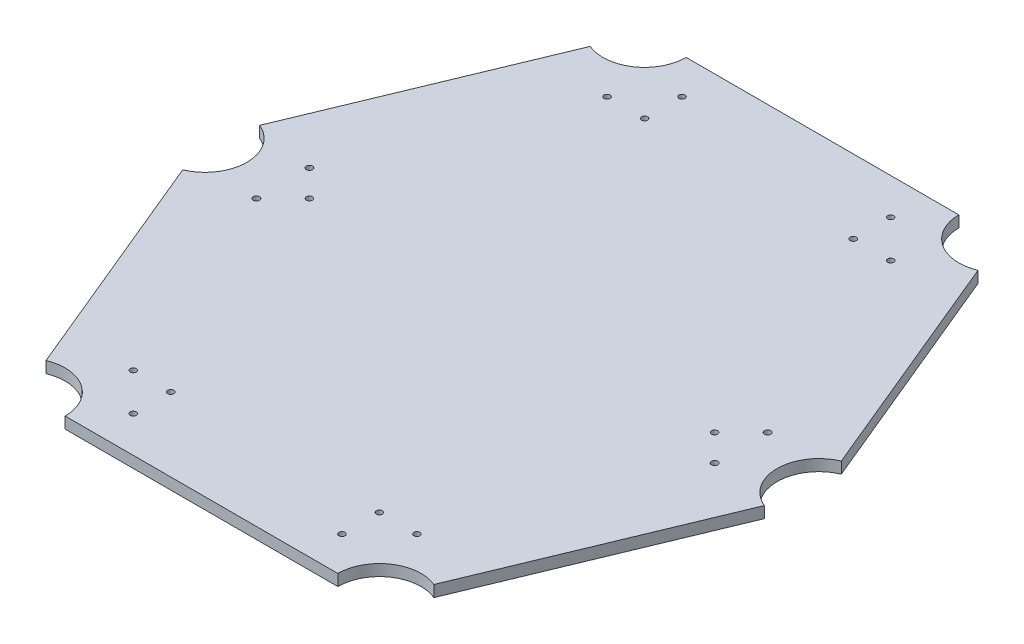
ISO-10303-21;
HEADER;
FILE_DESCRIPTION(('STEP AP214'),'2;1');
FILE_NAME('part.step','',(''),(''),'','','');
FILE_SCHEMA(('AUTOMOTIVE_DESIGN { 1 0 10303 214 1 1 1 1 }'));
ENDSEC;
DATA;
#1=APPLICATION_CONTEXT('core data for automotive mechanical design processes');
#2=APPLICATION_PROTOCOL_DEFINITION('international standard','automotive_design',2000,#1);
#3=PRODUCT_CONTEXT('',#1,'mechanical');
#4=PRODUCT('Part','Part','',(#3));
#5=PRODUCT_RELATED_PRODUCT_CATEGORY('part','',(#4));
#6=PRODUCT_DEFINITION_FORMATION('','',#4);
#7=PRODUCT_DEFINITION_CONTEXT('part definition',#1,'design');
#8=PRODUCT_DEFINITION('design','',#6,#7);
#9=PRODUCT_DEFINITION_SHAPE('','',#8);
#10=(LENGTH_UNIT() NAMED_UNIT(*) SI_UNIT(.MILLI.,.METRE.));
#11=(NAMED_UNIT(*) PLANE_ANGLE_UNIT() SI_UNIT($,.RADIAN.));
#12=(NAMED_UNIT(*) SI_UNIT($,.STERADIAN.) SOLID_ANGLE_UNIT());
#13=UNCERTAINTY_MEASURE_WITH_UNIT(LENGTH_MEASURE(1.E-05),#10,'distance_accuracy_value','');
#14=(GEOMETRIC_REPRESENTATION_CONTEXT(3) GLOBAL_UNCERTAINTY_ASSIGNED_CONTEXT((#13)) GLOBAL_UNIT_ASSIGNED_CONTEXT((#10,
#11,#12)) REPRESENTATION_CONTEXT('',''));
#15=CARTESIAN_POINT('',(0.,0.,0.));
#16=DIRECTION('',(0.,0.,1.));
#17=DIRECTION('',(1.,0.,0.));
#18=AXIS2_PLACEMENT_3D('',#15,#16,#17);
#19=CARTESIAN_POINT('',(47.,3.,82.));
#20=DIRECTION('',(-0.923742113571632,0.,-0.383015022700433));
#21=DIRECTION('',(-0.383015022700433,0.,0.923742113571632));
#22=AXIS2_PLACEMENT_3D('',#19,#20,#21);
#23=PLANE('',#22);
#24=DIRECTION('',(0.383015022700433,0.,-0.923742113571632));
#25=VECTOR('',#24,1.);
#26=CARTESIAN_POINT('',(47.,3.,82.));
#27=LINE('',#26,#25);
#28=CARTESIAN_POINT('',(51.2131652497048,3.,71.838836750712));
#29=VERTEX_POINT('',#28);
#30=CARTESIAN_POINT('',(76.7868347502952,3.,10.161163249288));
#31=VERTEX_POINT('',#30);
#32=EDGE_CURVE('E156',#29,#31,#27,.T.);
#33=ORIENTED_EDGE('',*,*,#32,.F.);
#34=DIRECTION('',(0.,1.,0.));
#35=VECTOR('',#34,1.);
#36=CARTESIAN_POINT('',(51.2131652497048,0.,71.838836750712));
#37=LINE('',#36,#35);
#38=CARTESIAN_POINT('',(51.2131652497048,0.,71.838836750712));
#39=VERTEX_POINT('',#38);
#40=EDGE_CURVE('E212',#29,#39,#37,.F.);
#41=ORIENTED_EDGE('',*,*,#40,.T.);
#42=DIRECTION('',(0.383015022700433,0.,-0.923742113571632));
#43=VECTOR('',#42,1.);
#44=CARTESIAN_POINT('',(47.,0.,82.));
#45=LINE('',#44,#43);
#46=CARTESIAN_POINT('',(76.7868347502952,0.,10.161163249288));
#47=VERTEX_POINT('',#46);
#48=EDGE_CURVE('E183',#39,#47,#45,.T.);
#49=ORIENTED_EDGE('',*,*,#48,.T.);
#50=DIRECTION('',(0.,1.,0.));
#51=VECTOR('',#50,1.);
#52=CARTESIAN_POINT('',(76.7868347502952,0.,10.161163249288));
#53=LINE('',#52,#51);
#54=EDGE_CURVE('E207',#47,#31,#53,.T.);
#55=ORIENTED_EDGE('',*,*,#54,.T.);
#56=EDGE_LOOP('',(#33,#41,#49,#55));
#57=FACE_BOUND('',#56,.T.);
#58=ADVANCED_FACE('F39',(#57),#23,.F.);
#59=CARTESIAN_POINT('',(47.,3.,-82.));
#60=DIRECTION('',(-0.923742113571632,0.,0.383015022700433));
#61=DIRECTION('',(0.383015022700433,0.,0.923742113571632));
#62=AXIS2_PLACEMENT_3D('',#59,#60,#61);
#63=PLANE('',#62);
#64=DIRECTION('',(-0.383015022700433,0.,-0.923742113571632));
#65=VECTOR('',#64,1.);
#66=CARTESIAN_POINT('',(47.,3.,-82.));
#67=LINE('',#66,#65);
#68=CARTESIAN_POINT('',(76.7868347502952,3.,-10.161163249288));
#69=VERTEX_POINT('',#68);
#70=CARTESIAN_POINT('',(51.2131652497048,3.,-71.838836750712));
#71=VERTEX_POINT('',#70);
#72=EDGE_CURVE('E162',#69,#71,#67,.T.);
#73=ORIENTED_EDGE('',*,*,#72,.F.);
#74=DIRECTION('',(0.,1.,0.));
#75=VECTOR('',#74,1.);
#76=CARTESIAN_POINT('',(76.7868347502952,0.,-10.161163249288));
#77=LINE('',#76,#75);
#78=CARTESIAN_POINT('',(76.7868347502952,0.,-10.161163249288));
#79=VERTEX_POINT('',#78);
#80=EDGE_CURVE('E191',#69,#79,#77,.F.);
#81=ORIENTED_EDGE('',*,*,#80,.T.);
#82=DIRECTION('',(-0.383015022700433,0.,-0.923742113571632));
#83=VECTOR('',#82,1.);
#84=CARTESIAN_POINT('',(47.,0.,-82.));
#85=LINE('',#84,#83);
#86=CARTESIAN_POINT('',(51.2131652497048,0.,-71.838836750712));
#87=VERTEX_POINT('',#86);
#88=EDGE_CURVE('E151',#79,#87,#85,.T.);
#89=ORIENTED_EDGE('',*,*,#88,.T.);
#90=DIRECTION('',(0.,1.,0.));
#91=VECTOR('',#90,1.);
#92=CARTESIAN_POINT('',(51.2131652497048,0.,-71.838836750712));
#93=LINE('',#92,#91);
#94=EDGE_CURVE('E52',#87,#71,#93,.T.);
#95=ORIENTED_EDGE('',*,*,#94,.T.);
#96=EDGE_LOOP('',(#73,#81,#89,#95));
#97=FACE_BOUND('',#96,.T.);
#98=ADVANCED_FACE('F190',(#97),#63,.F.);
#99=CARTESIAN_POINT('',(-47.,3.,-82.));
#100=DIRECTION('',(0.,0.,1.));
#101=DIRECTION('',(1.,0.,0.));
#102=AXIS2_PLACEMENT_3D('',#99,#100,#101);
#103=PLANE('',#102);
#104=DIRECTION('',(-1.,0.,0.));
#105=VECTOR('',#104,1.);
#106=CARTESIAN_POINT('',(-47.,3.,-82.));
#107=LINE('',#106,#105);
#108=CARTESIAN_POINT('',(36.,3.,-82.));
#109=VERTEX_POINT('',#108);
#110=CARTESIAN_POINT('',(-36.,3.,-82.));
#111=VERTEX_POINT('',#110);
#112=EDGE_CURVE('E169',#109,#111,#107,.T.);
#113=ORIENTED_EDGE('',*,*,#112,.F.);
#114=DIRECTION('',(0.,1.,0.));
#115=VECTOR('',#114,1.);
#116=CARTESIAN_POINT('',(36.,0.,-82.));
#117=LINE('',#116,#115);
#118=CARTESIAN_POINT('',(36.,0.,-82.));
#119=VERTEX_POINT('',#118);
#120=EDGE_CURVE('E197',#109,#119,#117,.F.);
#121=ORIENTED_EDGE('',*,*,#120,.T.);
#122=DIRECTION('',(-1.,0.,0.));
#123=VECTOR('',#122,1.);
#124=CARTESIAN_POINT('',(-47.,0.,-82.));
#125=LINE('',#124,#123);
#126=CARTESIAN_POINT('',(-36.,0.,-82.));
#127=VERTEX_POINT('',#126);
#128=EDGE_CURVE('E146',#119,#127,#125,.T.);
#129=ORIENTED_EDGE('',*,*,#128,.T.);
#130=DIRECTION('',(0.,1.,0.));
#131=VECTOR('',#130,1.);
#132=CARTESIAN_POINT('',(-36.,0.,-82.));
#133=LINE('',#132,#131);
#134=EDGE_CURVE('E60',#127,#111,#133,.T.);
#135=ORIENTED_EDGE('',*,*,#134,.T.);
#136=EDGE_LOOP('',(#113,#121,#129,#135));
#137=FACE_BOUND('',#136,.T.);
#138=ADVANCED_FACE('F201',(#137),#103,.F.);
#139=CARTESIAN_POINT('',(-47.,3.,-82.));
#140=DIRECTION('',(0.923742113571632,0.,0.383015022700433));
#141=DIRECTION('',(0.383015022700433,0.,-0.923742113571632));
#142=AXIS2_PLACEMENT_3D('',#139,#140,#141);
#143=PLANE('',#142);
#144=DIRECTION('',(-0.383015022700433,0.,0.923742113571632));
#145=VECTOR('',#144,1.);
#146=CARTESIAN_POINT('',(-47.,0.,-82.));
#147=LINE('',#146,#145);
#148=CARTESIAN_POINT('',(-51.2131652497048,0.,-71.838836750712));
#149=VERTEX_POINT('',#148);
#150=CARTESIAN_POINT('',(-76.7868347502952,0.,-10.161163249288));
#151=VERTEX_POINT('',#150);
#152=EDGE_CURVE('E137',#149,#151,#147,.T.);
#153=ORIENTED_EDGE('',*,*,#152,.T.);
#154=DIRECTION('',(0.,1.,0.));
#155=VECTOR('',#154,1.);
#156=CARTESIAN_POINT('',(-76.7868347502952,0.,-10.161163249288));
#157=LINE('',#156,#155);
#158=CARTESIAN_POINT('',(-76.7868347502952,3.,-10.161163249288));
#159=VERTEX_POINT('',#158);
#160=EDGE_CURVE('E172',#151,#159,#157,.T.);
#161=ORIENTED_EDGE('',*,*,#160,.T.);
#162=DIRECTION('',(-0.383015022700433,0.,0.923742113571632));
#163=VECTOR('',#162,1.);
#164=CARTESIAN_POINT('',(-47.,3.,-82.));
#165=LINE('',#164,#163);
#166=CARTESIAN_POINT('',(-51.2131652497048,3.,-71.838836750712));
#167=VERTEX_POINT('',#166);
#168=EDGE_CURVE('E139',#167,#159,#165,.T.);
#169=ORIENTED_EDGE('',*,*,#168,.F.);
#170=DIRECTION('',(0.,1.,0.));
#171=VECTOR('',#170,1.);
#172=CARTESIAN_POINT('',(-51.2131652497048,0.,-71.838836750712));
#173=LINE('',#172,#171);
#174=EDGE_CURVE('E125',#167,#149,#173,.F.);
#175=ORIENTED_EDGE('',*,*,#174,.T.);
#176=EDGE_LOOP('',(#153,#161,#169,#175));
#177=FACE_BOUND('',#176,.T.);
#178=ADVANCED_FACE('F135',(#177),#143,.F.);
#179=CARTESIAN_POINT('',(-47.,3.,82.));
#180=DIRECTION('',(0.923742113571632,0.,-0.383015022700433));
#181=DIRECTION('',(-0.383015022700433,0.,-0.923742113571632));
#182=AXIS2_PLACEMENT_3D('',#179,#180,#181);
#183=PLANE('',#182);
#184=DIRECTION('',(0.383015022700433,0.,0.923742113571632));
#185=VECTOR('',#184,1.);
#186=CARTESIAN_POINT('',(-47.,3.,82.));
#187=LINE('',#186,#185);
#188=CARTESIAN_POINT('',(-76.7868347502952,3.,10.161163249288));
#189=VERTEX_POINT('',#188);
#190=CARTESIAN_POINT('',(-51.2131652497048,3.,71.838836750712));
#191=VERTEX_POINT('',#190);
#192=EDGE_CURVE('E178',#189,#191,#187,.T.);
#193=ORIENTED_EDGE('',*,*,#192,.F.);
#194=DIRECTION('',(0.,1.,0.));
#195=VECTOR('',#194,1.);
#196=CARTESIAN_POINT('',(-76.7868347502952,0.,10.161163249288));
#197=LINE('',#196,#195);
#198=CARTESIAN_POINT('',(-76.7868347502952,0.,10.161163249288));
#199=VERTEX_POINT('',#198);
#200=EDGE_CURVE('E219',#189,#199,#197,.F.);
#201=ORIENTED_EDGE('',*,*,#200,.T.);
#202=DIRECTION('',(0.383015022700433,0.,0.923742113571632));
#203=VECTOR('',#202,1.);
#204=CARTESIAN_POINT('',(-47.,0.,82.));
#205=LINE('',#204,#203);
#206=CARTESIAN_POINT('',(-51.2131652497048,0.,71.838836750712));
#207=VERTEX_POINT('',#206);
#208=EDGE_CURVE('E145',#199,#207,#205,.T.);
#209=ORIENTED_EDGE('',*,*,#208,.T.);
#210=DIRECTION('',(0.,1.,0.));
#211=VECTOR('',#210,1.);
#212=CARTESIAN_POINT('',(-51.2131652497048,0.,71.838836750712));
#213=LINE('',#212,#211);
#214=EDGE_CURVE('E217',#207,#191,#213,.T.);
#215=ORIENTED_EDGE('',*,*,#214,.T.);
#216=EDGE_LOOP('',(#193,#201,#209,#215));
#217=FACE_BOUND('',#216,.T.);
#218=ADVANCED_FACE('F404',(#217),#183,.F.);
#219=CARTESIAN_POINT('',(-47.,3.,82.));
#220=DIRECTION('',(0.,0.,-1.));
#221=DIRECTION('',(-1.,0.,0.));
#222=AXIS2_PLACEMENT_3D('',#219,#220,#221);
#223=PLANE('',#222);
#224=DIRECTION('',(1.,0.,0.));
#225=VECTOR('',#224,1.);
#226=CARTESIAN_POINT('',(-47.,3.,82.));
#227=LINE('',#226,#225);
#228=CARTESIAN_POINT('',(-36.,3.,82.));
#229=VERTEX_POINT('',#228);
#230=CARTESIAN_POINT('',(36.,3.,82.));
#231=VERTEX_POINT('',#230);
#232=EDGE_CURVE('E131',#229,#231,#227,.T.);
#233=ORIENTED_EDGE('',*,*,#232,.F.);
#234=DIRECTION('',(0.,1.,0.));
#235=VECTOR('',#234,1.);
#236=CARTESIAN_POINT('',(-36.,0.,82.));
#237=LINE('',#236,#235);
#238=CARTESIAN_POINT('',(-36.,0.,82.));
#239=VERTEX_POINT('',#238);
#240=EDGE_CURVE('E215',#229,#239,#237,.F.);
#241=ORIENTED_EDGE('',*,*,#240,.T.);
#242=DIRECTION('',(1.,0.,0.));
#243=VECTOR('',#242,1.);
#244=CARTESIAN_POINT('',(-47.,0.,82.));
#245=LINE('',#244,#243);
#246=CARTESIAN_POINT('',(36.,0.,82.));
#247=VERTEX_POINT('',#246);
#248=EDGE_CURVE('E149',#239,#247,#245,.T.);
#249=ORIENTED_EDGE('',*,*,#248,.T.);
#250=DIRECTION('',(0.,1.,0.));
#251=VECTOR('',#250,1.);
#252=CARTESIAN_POINT('',(36.,0.,82.));
#253=LINE('',#252,#251);
#254=EDGE_CURVE('E210',#247,#231,#253,.T.);
#255=ORIENTED_EDGE('',*,*,#254,.T.);
#256=EDGE_LOOP('',(#233,#241,#249,#255));
#257=FACE_BOUND('',#256,.T.);
#258=ADVANCED_FACE('F398',(#257),#223,.F.);
#259=CARTESIAN_POINT('',(0.,3.,0.));
#260=DIRECTION('',(0.,-1.,0.));
#261=DIRECTION('',(0.,0.,-1.));
#262=AXIS2_PLACEMENT_3D('',#259,#260,#261);
#263=PLANE('',#262);
#264=CARTESIAN_POINT('',(60.5,3.,-7.));
#265=DIRECTION('',(0.,-1.,0.));
#266=DIRECTION('',(0.,0.,1.));
#267=AXIS2_PLACEMENT_3D('',#264,#265,#266);
#268=CIRCLE('',#267,0.825279091230489);
#269=CARTESIAN_POINT('',(60.5,3.,-6.17472090876951));
#270=VERTEX_POINT('',#269);
#271=EDGE_CURVE('E329',#270,#270,#268,.T.);
#272=ORIENTED_EDGE('',*,*,#271,.T.);
#273=EDGE_LOOP('',(#272));
#274=FACE_BOUND('',#273,.T.);
#275=CARTESIAN_POINT('',(60.5,3.,7.));
#276=DIRECTION('',(0.,-1.,0.));
#277=DIRECTION('',(0.,0.,-1.));
#278=AXIS2_PLACEMENT_3D('',#275,#276,#277);
#279=CIRCLE('',#278,0.825279091230489);
#280=CARTESIAN_POINT('',(60.5,3.,6.17472090876951));
#281=VERTEX_POINT('',#280);
#282=EDGE_CURVE('E323',#281,#281,#279,.T.);
#283=ORIENTED_EDGE('',*,*,#282,.T.);
#284=EDGE_LOOP('',(#283));
#285=FACE_BOUND('',#284,.T.);
#286=CARTESIAN_POINT('',(27.55456351737,3.,62.5545635173699));
#287=DIRECTION('',(0.,-1.,0.));
#288=DIRECTION('',(0.,0.,1.));
#289=AXIS2_PLACEMENT_3D('',#286,#287,#288);
#290=CIRCLE('',#289,0.8);
#291=CARTESIAN_POINT('',(27.55456351737,3.,63.3545635173699));
#292=VERTEX_POINT('',#291);
#293=EDGE_CURVE('E317',#292,#292,#290,.T.);
#294=ORIENTED_EDGE('',*,*,#293,.T.);
#295=EDGE_LOOP('',(#294));
#296=FACE_BOUND('',#295,.T.);
#297=CARTESIAN_POINT('',(37.4540584539817,3.,62.5545635173699));
#298=DIRECTION('',(0.,-1.,0.));
#299=DIRECTION('',(0.,0.,1.));
#300=AXIS2_PLACEMENT_3D('',#297,#298,#299);
#301=CIRCLE('',#300,0.800000000000003);
#302=CARTESIAN_POINT('',(37.4540584539817,3.,63.3545635173699));
#303=VERTEX_POINT('',#302);
#304=EDGE_CURVE('E310',#303,#303,#301,.T.);
#305=ORIENTED_EDGE('',*,*,#304,.T.);
#306=EDGE_LOOP('',(#305));
#307=FACE_BOUND('',#306,.T.);
#308=CARTESIAN_POINT('',(37.4540584539815,3.,-62.55456351737));
#309=DIRECTION('',(0.,-1.,0.));
#310=DIRECTION('',(0.,0.,-1.));
#311=AXIS2_PLACEMENT_3D('',#308,#309,#310);
#312=CIRCLE('',#311,0.799999999999988);
#313=CARTESIAN_POINT('',(37.4540584539815,3.,-63.35456351737));
#314=VERTEX_POINT('',#313);
#315=EDGE_CURVE('E346',#314,#314,#312,.T.);
#316=ORIENTED_EDGE('',*,*,#315,.T.);
#317=EDGE_LOOP('',(#316));
#318=FACE_BOUND('',#317,.T.);
#319=CARTESIAN_POINT('',(27.5545635173698,3.,-62.5545635173701));
#320=DIRECTION('',(0.,-1.,0.));
#321=DIRECTION('',(0.,0.,1.));
#322=AXIS2_PLACEMENT_3D('',#319,#320,#321);
#323=CIRCLE('',#322,0.799999999999998);
#324=CARTESIAN_POINT('',(27.5545635173698,3.,-61.7545635173701));
#325=VERTEX_POINT('',#324);
#326=EDGE_CURVE('E352',#325,#325,#323,.T.);
#327=ORIENTED_EDGE('',*,*,#326,.T.);
#328=EDGE_LOOP('',(#327));
#329=FACE_BOUND('',#328,.T.);
#330=CARTESIAN_POINT('',(27.55456351737,3.,72.4540584539816));
#331=DIRECTION('',(0.,-1.,0.));
#332=DIRECTION('',(0.,0.,-1.));
#333=AXIS2_PLACEMENT_3D('',#330,#331,#332);
#334=CIRCLE('',#333,0.800000000000001);
#335=CARTESIAN_POINT('',(27.55456351737,3.,71.6540584539816));
#336=VERTEX_POINT('',#335);
#337=EDGE_CURVE('E334',#336,#336,#334,.T.);
#338=ORIENTED_EDGE('',*,*,#337,.T.);
#339=EDGE_LOOP('',(#338));
#340=FACE_BOUND('',#339,.T.);
#341=CARTESIAN_POINT('',(27.5545635173699,3.,-72.4540584539817));
#342=DIRECTION('',(0.,-1.,0.));
#343=DIRECTION('',(0.,0.,1.));
#344=AXIS2_PLACEMENT_3D('',#341,#342,#343);
#345=CIRCLE('',#344,0.799999999999999);
#346=CARTESIAN_POINT('',(27.5545635173699,3.,-71.6540584539817));
#347=VERTEX_POINT('',#346);
#348=EDGE_CURVE('E341',#347,#347,#345,.T.);
#349=ORIENTED_EDGE('',*,*,#348,.T.);
#350=EDGE_LOOP('',(#349));
#351=FACE_BOUND('',#350,.T.);
#352=CARTESIAN_POINT('',(53.5,3.,0.));
#353=DIRECTION('',(0.,-1.,0.));
#354=DIRECTION('',(0.,0.,1.));
#355=AXIS2_PLACEMENT_3D('',#352,#353,#354);
#356=CIRCLE('',#355,0.800000000000003);
#357=CARTESIAN_POINT('',(53.5,3.,0.800000000000003));
#358=VERTEX_POINT('',#357);
#359=EDGE_CURVE('E304',#358,#358,#356,.T.);
#360=ORIENTED_EDGE('',*,*,#359,.T.);
#361=EDGE_LOOP('',(#360));
#362=FACE_BOUND('',#361,.T.);
#363=CARTESIAN_POINT('',(-60.5,3.,-7.));
#364=DIRECTION('',(0.,1.,0.));
#365=DIRECTION('',(0.,0.,1.));
#366=AXIS2_PLACEMENT_3D('',#363,#364,#365);
#367=CIRCLE('',#366,0.825279091230489);
#368=CARTESIAN_POINT('',(-60.5,3.,-6.17472090876951));
#369=VERTEX_POINT('',#368);
#370=EDGE_CURVE('E253',#369,#369,#367,.T.);
#371=ORIENTED_EDGE('',*,*,#370,.F.);
#372=EDGE_LOOP('',(#371));
#373=FACE_BOUND('',#372,.T.);
#374=CARTESIAN_POINT('',(-60.5,3.,7.));
#375=DIRECTION('',(0.,1.,0.));
#376=DIRECTION('',(0.,0.,-1.));
#377=AXIS2_PLACEMENT_3D('',#374,#375,#376);
#378=CIRCLE('',#377,0.825279091230489);
#379=CARTESIAN_POINT('',(-60.5,3.,6.17472090876951));
#380=VERTEX_POINT('',#379);
#381=EDGE_CURVE('E272',#380,#380,#378,.T.);
#382=ORIENTED_EDGE('',*,*,#381,.F.);
#383=EDGE_LOOP('',(#382));
#384=FACE_BOUND('',#383,.T.);
#385=CARTESIAN_POINT('',(-27.55456351737,3.,62.5545635173699));
#386=DIRECTION('',(0.,1.,0.));
#387=DIRECTION('',(0.,0.,1.));
#388=AXIS2_PLACEMENT_3D('',#385,#386,#387);
#389=CIRCLE('',#388,0.8);
#390=CARTESIAN_POINT('',(-27.55456351737,3.,63.3545635173699));
#391=VERTEX_POINT('',#390);
#392=EDGE_CURVE('E266',#391,#391,#389,.T.);
#393=ORIENTED_EDGE('',*,*,#392,.F.);
#394=EDGE_LOOP('',(#393));
#395=FACE_BOUND('',#394,.T.);
#396=CARTESIAN_POINT('',(-37.4540584539817,3.,62.5545635173699));
#397=DIRECTION('',(0.,1.,0.));
#398=DIRECTION('',(0.,0.,1.));
#399=AXIS2_PLACEMENT_3D('',#396,#397,#398);
#400=CIRCLE('',#399,0.800000000000003);
#401=CARTESIAN_POINT('',(-37.4540584539817,3.,63.3545635173699));
#402=VERTEX_POINT('',#401);
#403=EDGE_CURVE('E259',#402,#402,#400,.T.);
#404=ORIENTED_EDGE('',*,*,#403,.F.);
#405=EDGE_LOOP('',(#404));
#406=FACE_BOUND('',#405,.T.);
#407=CARTESIAN_POINT('',(-37.4540584539815,3.,-62.55456351737));
#408=DIRECTION('',(0.,1.,0.));
#409=DIRECTION('',(0.,0.,-1.));
#410=AXIS2_PLACEMENT_3D('',#407,#408,#409);
#411=CIRCLE('',#410,0.799999999999988);
#412=CARTESIAN_POINT('',(-37.4540584539815,3.,-63.35456351737));
#413=VERTEX_POINT('',#412);
#414=EDGE_CURVE('E295',#413,#413,#411,.T.);
#415=ORIENTED_EDGE('',*,*,#414,.F.);
#416=EDGE_LOOP('',(#415));
#417=FACE_BOUND('',#416,.T.);
#418=CARTESIAN_POINT('',(-27.5545635173698,3.,-62.5545635173701));
#419=DIRECTION('',(0.,1.,0.));
#420=DIRECTION('',(0.,0.,1.));
#421=AXIS2_PLACEMENT_3D('',#418,#419,#420);
#422=CIRCLE('',#421,0.799999999999998);
#423=CARTESIAN_POINT('',(-27.5545635173698,3.,-61.7545635173701));
#424=VERTEX_POINT('',#423);
#425=EDGE_CURVE('E284',#424,#424,#422,.T.);
#426=ORIENTED_EDGE('',*,*,#425,.F.);
#427=EDGE_LOOP('',(#426));
#428=FACE_BOUND('',#427,.T.);
#429=CARTESIAN_POINT('',(-27.55456351737,3.,72.4540584539816));
#430=DIRECTION('',(0.,1.,0.));
#431=DIRECTION('',(0.,0.,-1.));
#432=AXIS2_PLACEMENT_3D('',#429,#430,#431);
#433=CIRCLE('',#432,0.800000000000001);
#434=CARTESIAN_POINT('',(-27.55456351737,3.,71.6540584539816));
#435=VERTEX_POINT('',#434);
#436=EDGE_CURVE('E283',#435,#435,#433,.T.);
#437=ORIENTED_EDGE('',*,*,#436,.F.);
#438=EDGE_LOOP('',(#437));
#439=FACE_BOUND('',#438,.T.);
#440=CARTESIAN_POINT('',(-27.5545635173699,3.,-72.4540584539817));
#441=DIRECTION('',(0.,1.,0.));
#442=DIRECTION('',(0.,0.,1.));
#443=AXIS2_PLACEMENT_3D('',#440,#441,#442);
#444=CIRCLE('',#443,0.799999999999999);
#445=CARTESIAN_POINT('',(-27.5545635173699,3.,-71.6540584539817));
#446=VERTEX_POINT('',#445);
#447=EDGE_CURVE('E260',#446,#446,#444,.T.);
#448=ORIENTED_EDGE('',*,*,#447,.F.);
#449=EDGE_LOOP('',(#448));
#450=FACE_BOUND('',#449,.T.);
#451=CARTESIAN_POINT('',(-53.5,3.,0.));
#452=DIRECTION('',(0.,1.,0.));
#453=DIRECTION('',(0.,0.,1.));
#454=AXIS2_PLACEMENT_3D('',#451,#452,#453);
#455=CIRCLE('',#454,0.800000000000003);
#456=CARTESIAN_POINT('',(-53.5,3.,0.800000000000003));
#457=VERTEX_POINT('',#456);
#458=EDGE_CURVE('E250',#457,#457,#455,.T.);
#459=ORIENTED_EDGE('',*,*,#458,.F.);
#460=EDGE_LOOP('',(#459));
#461=FACE_BOUND('',#460,.T.);
#462=ORIENTED_EDGE('',*,*,#168,.T.);
#463=CARTESIAN_POINT('',(-81.,3.,0.));
#464=DIRECTION('',(0.,1.,0.));
#465=DIRECTION('',(0.,0.,1.));
#466=AXIS2_PLACEMENT_3D('',#463,#464,#465);
#467=CIRCLE('',#466,11.);
#468=EDGE_CURVE('E226',#189,#159,#467,.T.);
#469=ORIENTED_EDGE('',*,*,#468,.F.);
#470=ORIENTED_EDGE('',*,*,#192,.T.);
#471=CARTESIAN_POINT('',(-47.,3.,82.));
#472=DIRECTION('',(0.,1.,0.));
#473=DIRECTION('',(0.,0.,1.));
#474=AXIS2_PLACEMENT_3D('',#471,#472,#473);
#475=CIRCLE('',#474,11.);
#476=EDGE_CURVE('E243',#229,#191,#475,.T.);
#477=ORIENTED_EDGE('',*,*,#476,.F.);
#478=ORIENTED_EDGE('',*,*,#232,.T.);
#479=CARTESIAN_POINT('',(47.,3.,82.));
#480=DIRECTION('',(0.,1.,0.));
#481=DIRECTION('',(0.,0.,1.));
#482=AXIS2_PLACEMENT_3D('',#479,#480,#481);
#483=CIRCLE('',#482,11.);
#484=EDGE_CURVE('E239',#29,#231,#483,.T.);
#485=ORIENTED_EDGE('',*,*,#484,.F.);
#486=ORIENTED_EDGE('',*,*,#32,.T.);
#487=CARTESIAN_POINT('',(81.,3.,0.));
#488=DIRECTION('',(0.,1.,0.));
#489=DIRECTION('',(0.,0.,1.));
#490=AXIS2_PLACEMENT_3D('',#487,#488,#489);
#491=CIRCLE('',#490,11.);
#492=EDGE_CURVE('E231',#69,#31,#491,.T.);
#493=ORIENTED_EDGE('',*,*,#492,.F.);
#494=ORIENTED_EDGE('',*,*,#72,.T.);
#495=CARTESIAN_POINT('',(47.,3.,-82.));
#496=DIRECTION('',(0.,1.,0.));
#497=DIRECTION('',(0.,0.,1.));
#498=AXIS2_PLACEMENT_3D('',#495,#496,#497);
#499=CIRCLE('',#498,11.);
#500=EDGE_CURVE('E228',#109,#71,#499,.T.);
#501=ORIENTED_EDGE('',*,*,#500,.F.);
#502=ORIENTED_EDGE('',*,*,#112,.T.);
#503=CARTESIAN_POINT('',(-47.,3.,-82.));
#504=DIRECTION('',(0.,1.,0.));
#505=DIRECTION('',(0.,0.,1.));
#506=AXIS2_PLACEMENT_3D('',#503,#504,#505);
#507=CIRCLE('',#506,11.);
#508=EDGE_CURVE('E227',#167,#111,#507,.T.);
#509=ORIENTED_EDGE('',*,*,#508,.F.);
#510=EDGE_LOOP('',(#462,#469,#470,#477,#478,#485,#486,#493,#494,#501,#502,#509));
#511=FACE_BOUND('',#510,.T.);
#512=ADVANCED_FACE('F225',(#274,#285,#296,#307,#318,#329,#340,#351,#362,#373,#384,#395,#406,
#417,#428,#439,#450,#461,#511),#263,.F.);
#513=CARTESIAN_POINT('',(0.,0.,0.));
#514=DIRECTION('',(0.,-1.,0.));
#515=DIRECTION('',(0.,0.,-1.));
#516=AXIS2_PLACEMENT_3D('',#513,#514,#515);
#517=PLANE('',#516);
#518=CARTESIAN_POINT('',(60.5,0.,-7.));
#519=DIRECTION('',(0.,-1.,0.));
#520=DIRECTION('',(0.,0.,1.));
#521=AXIS2_PLACEMENT_3D('',#518,#519,#520);
#522=CIRCLE('',#521,0.825279091230489);
#523=CARTESIAN_POINT('',(60.5,0.,-6.17472090876951));
#524=VERTEX_POINT('',#523);
#525=EDGE_CURVE('E307',#524,#524,#522,.T.);
#526=ORIENTED_EDGE('',*,*,#525,.F.);
#527=EDGE_LOOP('',(#526));
#528=FACE_BOUND('',#527,.T.);
#529=CARTESIAN_POINT('',(60.5,0.,7.));
#530=DIRECTION('',(0.,-1.,0.));
#531=DIRECTION('',(0.,0.,-1.));
#532=AXIS2_PLACEMENT_3D('',#529,#530,#531);
#533=CIRCLE('',#532,0.825279091230489);
#534=CARTESIAN_POINT('',(60.5,0.,6.17472090876951));
#535=VERTEX_POINT('',#534);
#536=EDGE_CURVE('E326',#535,#535,#533,.T.);
#537=ORIENTED_EDGE('',*,*,#536,.F.);
#538=EDGE_LOOP('',(#537));
#539=FACE_BOUND('',#538,.T.);
#540=CARTESIAN_POINT('',(27.55456351737,0.,62.5545635173699));
#541=DIRECTION('',(0.,-1.,0.));
#542=DIRECTION('',(0.,0.,1.));
#543=AXIS2_PLACEMENT_3D('',#540,#541,#542);
#544=CIRCLE('',#543,0.8);
#545=CARTESIAN_POINT('',(27.55456351737,0.,63.3545635173699));
#546=VERTEX_POINT('',#545);
#547=EDGE_CURVE('E320',#546,#546,#544,.T.);
#548=ORIENTED_EDGE('',*,*,#547,.F.);
#549=EDGE_LOOP('',(#548));
#550=FACE_BOUND('',#549,.T.);
#551=CARTESIAN_POINT('',(37.4540584539817,0.,62.5545635173699));
#552=DIRECTION('',(0.,-1.,0.));
#553=DIRECTION('',(0.,0.,1.));
#554=AXIS2_PLACEMENT_3D('',#551,#552,#553);
#555=CIRCLE('',#554,0.800000000000003);
#556=CARTESIAN_POINT('',(37.4540584539817,0.,63.3545635173699));
#557=VERTEX_POINT('',#556);
#558=EDGE_CURVE('E313',#557,#557,#555,.T.);
#559=ORIENTED_EDGE('',*,*,#558,.F.);
#560=EDGE_LOOP('',(#559));
#561=FACE_BOUND('',#560,.T.);
#562=CARTESIAN_POINT('',(37.4540584539815,0.,-62.55456351737));
#563=DIRECTION('',(0.,-1.,0.));
#564=DIRECTION('',(0.,0.,-1.));
#565=AXIS2_PLACEMENT_3D('',#562,#563,#564);
#566=CIRCLE('',#565,0.799999999999988);
#567=CARTESIAN_POINT('',(37.4540584539815,0.,-63.35456351737));
#568=VERTEX_POINT('',#567);
#569=EDGE_CURVE('E349',#568,#568,#566,.T.);
#570=ORIENTED_EDGE('',*,*,#569,.F.);
#571=EDGE_LOOP('',(#570));
#572=FACE_BOUND('',#571,.T.);
#573=CARTESIAN_POINT('',(27.5545635173698,0.,-62.5545635173701));
#574=DIRECTION('',(0.,-1.,0.));
#575=DIRECTION('',(0.,0.,1.));
#576=AXIS2_PLACEMENT_3D('',#573,#574,#575);
#577=CIRCLE('',#576,0.799999999999998);
#578=CARTESIAN_POINT('',(27.5545635173698,0.,-61.7545635173701));
#579=VERTEX_POINT('',#578);
#580=EDGE_CURVE('E338',#579,#579,#577,.T.);
#581=ORIENTED_EDGE('',*,*,#580,.F.);
#582=EDGE_LOOP('',(#581));
#583=FACE_BOUND('',#582,.T.);
#584=CARTESIAN_POINT('',(27.55456351737,0.,72.4540584539816));
#585=DIRECTION('',(0.,-1.,0.));
#586=DIRECTION('',(0.,0.,-1.));
#587=AXIS2_PLACEMENT_3D('',#584,#585,#586);
#588=CIRCLE('',#587,0.800000000000001);
#589=CARTESIAN_POINT('',(27.55456351737,0.,71.6540584539816));
#590=VERTEX_POINT('',#589);
#591=EDGE_CURVE('E337',#590,#590,#588,.T.);
#592=ORIENTED_EDGE('',*,*,#591,.F.);
#593=EDGE_LOOP('',(#592));
#594=FACE_BOUND('',#593,.T.);
#595=CARTESIAN_POINT('',(27.5545635173699,0.,-72.4540584539817));
#596=DIRECTION('',(0.,-1.,0.));
#597=DIRECTION('',(0.,0.,1.));
#598=AXIS2_PLACEMENT_3D('',#595,#596,#597);
#599=CIRCLE('',#598,0.799999999999999);
#600=CARTESIAN_POINT('',(27.5545635173699,0.,-71.6540584539817));
#601=VERTEX_POINT('',#600);
#602=EDGE_CURVE('E314',#601,#601,#599,.T.);
#603=ORIENTED_EDGE('',*,*,#602,.F.);
#604=EDGE_LOOP('',(#603));
#605=FACE_BOUND('',#604,.T.);
#606=CARTESIAN_POINT('',(53.5,0.,0.));
#607=DIRECTION('',(0.,-1.,0.));
#608=DIRECTION('',(0.,0.,1.));
#609=AXIS2_PLACEMENT_3D('',#606,#607,#608);
#610=CIRCLE('',#609,0.800000000000003);
#611=CARTESIAN_POINT('',(53.5,0.,0.800000000000003));
#612=VERTEX_POINT('',#611);
#613=EDGE_CURVE('E296',#612,#612,#610,.T.);
#614=ORIENTED_EDGE('',*,*,#613,.F.);
#615=EDGE_LOOP('',(#614));
#616=FACE_BOUND('',#615,.T.);
#617=CARTESIAN_POINT('',(-60.5,0.,-7.));
#618=DIRECTION('',(0.,1.,0.));
#619=DIRECTION('',(0.,0.,1.));
#620=AXIS2_PLACEMENT_3D('',#617,#618,#619);
#621=CIRCLE('',#620,0.825279091230489);
#622=CARTESIAN_POINT('',(-60.5,0.,-6.17472090876951));
#623=VERTEX_POINT('',#622);
#624=EDGE_CURVE('E275',#623,#623,#621,.T.);
#625=ORIENTED_EDGE('',*,*,#624,.T.);
#626=EDGE_LOOP('',(#625));
#627=FACE_BOUND('',#626,.T.);
#628=CARTESIAN_POINT('',(-60.5,0.,7.));
#629=DIRECTION('',(0.,1.,0.));
#630=DIRECTION('',(0.,0.,-1.));
#631=AXIS2_PLACEMENT_3D('',#628,#629,#630);
#632=CIRCLE('',#631,0.825279091230489);
#633=CARTESIAN_POINT('',(-60.5,0.,6.17472090876951));
#634=VERTEX_POINT('',#633);
#635=EDGE_CURVE('E269',#634,#634,#632,.T.);
#636=ORIENTED_EDGE('',*,*,#635,.T.);
#637=EDGE_LOOP('',(#636));
#638=FACE_BOUND('',#637,.T.);
#639=CARTESIAN_POINT('',(-27.55456351737,0.,62.5545635173699));
#640=DIRECTION('',(0.,1.,0.));
#641=DIRECTION('',(0.,0.,1.));
#642=AXIS2_PLACEMENT_3D('',#639,#640,#641);
#643=CIRCLE('',#642,0.8);
#644=CARTESIAN_POINT('',(-27.55456351737,0.,63.3545635173699));
#645=VERTEX_POINT('',#644);
#646=EDGE_CURVE('E263',#645,#645,#643,.T.);
#647=ORIENTED_EDGE('',*,*,#646,.T.);
#648=EDGE_LOOP('',(#647));
#649=FACE_BOUND('',#648,.T.);
#650=CARTESIAN_POINT('',(-37.4540584539817,0.,62.5545635173699));
#651=DIRECTION('',(0.,1.,0.));
#652=DIRECTION('',(0.,0.,1.));
#653=AXIS2_PLACEMENT_3D('',#650,#651,#652);
#654=CIRCLE('',#653,0.800000000000003);
#655=CARTESIAN_POINT('',(-37.4540584539817,0.,63.3545635173699));
#656=VERTEX_POINT('',#655);
#657=EDGE_CURVE('E256',#656,#656,#654,.T.);
#658=ORIENTED_EDGE('',*,*,#657,.T.);
#659=EDGE_LOOP('',(#658));
#660=FACE_BOUND('',#659,.T.);
#661=CARTESIAN_POINT('',(-37.4540584539815,0.,-62.55456351737));
#662=DIRECTION('',(0.,1.,0.));
#663=DIRECTION('',(0.,0.,-1.));
#664=AXIS2_PLACEMENT_3D('',#661,#662,#663);
#665=CIRCLE('',#664,0.799999999999988);
#666=CARTESIAN_POINT('',(-37.4540584539815,0.,-63.35456351737));
#667=VERTEX_POINT('',#666);
#668=EDGE_CURVE('E292',#667,#667,#665,.T.);
#669=ORIENTED_EDGE('',*,*,#668,.T.);
#670=EDGE_LOOP('',(#669));
#671=FACE_BOUND('',#670,.T.);
#672=CARTESIAN_POINT('',(-27.5545635173698,0.,-62.5545635173701));
#673=DIRECTION('',(0.,1.,0.));
#674=DIRECTION('',(0.,0.,1.));
#675=AXIS2_PLACEMENT_3D('',#672,#673,#674);
#676=CIRCLE('',#675,0.799999999999998);
#677=CARTESIAN_POINT('',(-27.5545635173698,0.,-61.7545635173701));
#678=VERTEX_POINT('',#677);
#679=EDGE_CURVE('E299',#678,#678,#676,.T.);
#680=ORIENTED_EDGE('',*,*,#679,.T.);
#681=EDGE_LOOP('',(#680));
#682=FACE_BOUND('',#681,.T.);
#683=CARTESIAN_POINT('',(-27.55456351737,0.,72.4540584539816));
#684=DIRECTION('',(0.,1.,0.));
#685=DIRECTION('',(0.,0.,-1.));
#686=AXIS2_PLACEMENT_3D('',#683,#684,#685);
#687=CIRCLE('',#686,0.800000000000001);
#688=CARTESIAN_POINT('',(-27.55456351737,0.,71.6540584539816));
#689=VERTEX_POINT('',#688);
#690=EDGE_CURVE('E280',#689,#689,#687,.T.);
#691=ORIENTED_EDGE('',*,*,#690,.T.);
#692=EDGE_LOOP('',(#691));
#693=FACE_BOUND('',#692,.T.);
#694=CARTESIAN_POINT('',(-27.5545635173699,0.,-72.4540584539817));
#695=DIRECTION('',(0.,1.,0.));
#696=DIRECTION('',(0.,0.,1.));
#697=AXIS2_PLACEMENT_3D('',#694,#695,#696);
#698=CIRCLE('',#697,0.799999999999999);
#699=CARTESIAN_POINT('',(-27.5545635173699,0.,-71.6540584539817));
#700=VERTEX_POINT('',#699);
#701=EDGE_CURVE('E287',#700,#700,#698,.T.);
#702=ORIENTED_EDGE('',*,*,#701,.T.);
#703=EDGE_LOOP('',(#702));
#704=FACE_BOUND('',#703,.T.);
#705=CARTESIAN_POINT('',(-53.5,0.,0.));
#706=DIRECTION('',(0.,1.,0.));
#707=DIRECTION('',(0.,0.,1.));
#708=AXIS2_PLACEMENT_3D('',#705,#706,#707);
#709=CIRCLE('',#708,0.800000000000003);
#710=CARTESIAN_POINT('',(-53.5,0.,0.800000000000003));
#711=VERTEX_POINT('',#710);
#712=EDGE_CURVE('E247',#711,#711,#709,.T.);
#713=ORIENTED_EDGE('',*,*,#712,.T.);
#714=EDGE_LOOP('',(#713));
#715=FACE_BOUND('',#714,.T.);
#716=CARTESIAN_POINT('',(-81.,0.,0.));
#717=DIRECTION('',(0.,1.,0.));
#718=DIRECTION('',(0.,0.,1.));
#719=AXIS2_PLACEMENT_3D('',#716,#717,#718);
#720=CIRCLE('',#719,11.);
#721=EDGE_CURVE('E140',#199,#151,#720,.T.);
#722=ORIENTED_EDGE('',*,*,#721,.T.);
#723=ORIENTED_EDGE('',*,*,#152,.F.);
#724=CARTESIAN_POINT('',(-47.,0.,-82.));
#725=DIRECTION('',(0.,-1.,0.));
#726=DIRECTION('',(0.,0.,-1.));
#727=AXIS2_PLACEMENT_3D('',#724,#725,#726);
#728=CIRCLE('',#727,11.);
#729=EDGE_CURVE('E46',#127,#149,#728,.T.);
#730=ORIENTED_EDGE('',*,*,#729,.F.);
#731=ORIENTED_EDGE('',*,*,#128,.F.);
#732=CARTESIAN_POINT('',(47.,0.,-82.));
#733=DIRECTION('',(0.,-1.,0.));
#734=DIRECTION('',(0.,0.,-1.));
#735=AXIS2_PLACEMENT_3D('',#732,#733,#734);
#736=CIRCLE('',#735,11.);
#737=EDGE_CURVE('E11',#87,#119,#736,.T.);
#738=ORIENTED_EDGE('',*,*,#737,.F.);
#739=ORIENTED_EDGE('',*,*,#88,.F.);
#740=CARTESIAN_POINT('',(81.,0.,0.));
#741=DIRECTION('',(0.,1.,0.));
#742=DIRECTION('',(0.,0.,1.));
#743=AXIS2_PLACEMENT_3D('',#740,#741,#742);
#744=CIRCLE('',#743,11.);
#745=EDGE_CURVE('E194',#79,#47,#744,.T.);
#746=ORIENTED_EDGE('',*,*,#745,.T.);
#747=ORIENTED_EDGE('',*,*,#48,.F.);
#748=CARTESIAN_POINT('',(47.,0.,82.));
#749=DIRECTION('',(0.,1.,0.));
#750=DIRECTION('',(0.,0.,1.));
#751=AXIS2_PLACEMENT_3D('',#748,#749,#750);
#752=CIRCLE('',#751,11.);
#753=EDGE_CURVE('E241',#39,#247,#752,.T.);
#754=ORIENTED_EDGE('',*,*,#753,.T.);
#755=ORIENTED_EDGE('',*,*,#248,.F.);
#756=CARTESIAN_POINT('',(-47.,0.,82.));
#757=DIRECTION('',(0.,1.,0.));
#758=DIRECTION('',(0.,0.,1.));
#759=AXIS2_PLACEMENT_3D('',#756,#757,#758);
#760=CIRCLE('',#759,11.);
#761=EDGE_CURVE('E234',#239,#207,#760,.T.);
#762=ORIENTED_EDGE('',*,*,#761,.T.);
#763=ORIENTED_EDGE('',*,*,#208,.F.);
#764=EDGE_LOOP('',(#722,#723,#730,#731,#738,#739,#746,#747,#754,#755,#762,#763));
#765=FACE_BOUND('',#764,.T.);
#766=ADVANCED_FACE('F143',(#528,#539,#550,#561,#572,#583,#594,#605,#616,#627,#638,#649,#660,
#671,#682,#693,#704,#715,#765),#517,.T.);
#767=CARTESIAN_POINT('',(-47.,0.,-82.));
#768=DIRECTION('',(0.,1.,0.));
#769=DIRECTION('',(0.,0.,1.));
#770=AXIS2_PLACEMENT_3D('',#767,#768,#769);
#771=CYLINDRICAL_SURFACE('',#770,11.);
#772=ORIENTED_EDGE('',*,*,#729,.T.);
#773=ORIENTED_EDGE('',*,*,#174,.F.);
#774=ORIENTED_EDGE('',*,*,#508,.T.);
#775=ORIENTED_EDGE('',*,*,#134,.F.);
#776=EDGE_LOOP('',(#772,#773,#774,#775));
#777=FACE_BOUND('',#776,.T.);
#778=ADVANCED_FACE('F124',(#777),#771,.F.);
#779=CARTESIAN_POINT('',(47.,0.,-82.));
#780=DIRECTION('',(0.,1.,0.));
#781=DIRECTION('',(0.,0.,1.));
#782=AXIS2_PLACEMENT_3D('',#779,#780,#781);
#783=CYLINDRICAL_SURFACE('',#782,11.);
#784=ORIENTED_EDGE('',*,*,#737,.T.);
#785=ORIENTED_EDGE('',*,*,#120,.F.);
#786=ORIENTED_EDGE('',*,*,#500,.T.);
#787=ORIENTED_EDGE('',*,*,#94,.F.);
#788=EDGE_LOOP('',(#784,#785,#786,#787));
#789=FACE_BOUND('',#788,.T.);
#790=ADVANCED_FACE('F196',(#789),#783,.F.);
#791=CARTESIAN_POINT('',(81.,0.,0.));
#792=DIRECTION('',(0.,1.,0.));
#793=DIRECTION('',(0.,0.,1.));
#794=AXIS2_PLACEMENT_3D('',#791,#792,#793);
#795=CYLINDRICAL_SURFACE('',#794,11.);
#796=ORIENTED_EDGE('',*,*,#745,.F.);
#797=ORIENTED_EDGE('',*,*,#80,.F.);
#798=ORIENTED_EDGE('',*,*,#492,.T.);
#799=ORIENTED_EDGE('',*,*,#54,.F.);
#800=EDGE_LOOP('',(#796,#797,#798,#799));
#801=FACE_BOUND('',#800,.T.);
#802=ADVANCED_FACE('F414',(#801),#795,.F.);
#803=CARTESIAN_POINT('',(47.,0.,82.));
#804=DIRECTION('',(0.,1.,0.));
#805=DIRECTION('',(0.,0.,1.));
#806=AXIS2_PLACEMENT_3D('',#803,#804,#805);
#807=CYLINDRICAL_SURFACE('',#806,11.);
#808=ORIENTED_EDGE('',*,*,#484,.T.);
#809=ORIENTED_EDGE('',*,*,#254,.F.);
#810=ORIENTED_EDGE('',*,*,#753,.F.);
#811=ORIENTED_EDGE('',*,*,#40,.F.);
#812=EDGE_LOOP('',(#808,#809,#810,#811));
#813=FACE_BOUND('',#812,.T.);
#814=ADVANCED_FACE('F416',(#813),#807,.F.);
#815=CARTESIAN_POINT('',(-47.,0.,82.));
#816=DIRECTION('',(0.,1.,0.));
#817=DIRECTION('',(0.,0.,1.));
#818=AXIS2_PLACEMENT_3D('',#815,#816,#817);
#819=CYLINDRICAL_SURFACE('',#818,11.);
#820=ORIENTED_EDGE('',*,*,#761,.F.);
#821=ORIENTED_EDGE('',*,*,#240,.F.);
#822=ORIENTED_EDGE('',*,*,#476,.T.);
#823=ORIENTED_EDGE('',*,*,#214,.F.);
#824=EDGE_LOOP('',(#820,#821,#822,#823));
#825=FACE_BOUND('',#824,.T.);
#826=ADVANCED_FACE('F422',(#825),#819,.F.);
#827=CARTESIAN_POINT('',(-81.,0.,0.));
#828=DIRECTION('',(0.,1.,0.));
#829=DIRECTION('',(0.,0.,1.));
#830=AXIS2_PLACEMENT_3D('',#827,#828,#829);
#831=CYLINDRICAL_SURFACE('',#830,11.);
#832=ORIENTED_EDGE('',*,*,#721,.F.);
#833=ORIENTED_EDGE('',*,*,#200,.F.);
#834=ORIENTED_EDGE('',*,*,#468,.T.);
#835=ORIENTED_EDGE('',*,*,#160,.F.);
#836=EDGE_LOOP('',(#832,#833,#834,#835));
#837=FACE_BOUND('',#836,.T.);
#838=ADVANCED_FACE('F393',(#837),#831,.F.);
#839=CARTESIAN_POINT('',(-53.5,0.,0.));
#840=DIRECTION('',(0.,1.,0.));
#841=DIRECTION('',(0.,0.,1.));
#842=AXIS2_PLACEMENT_3D('',#839,#840,#841);
#843=CYLINDRICAL_SURFACE('',#842,0.800000000000003);
#844=ORIENTED_EDGE('',*,*,#712,.F.);
#845=EDGE_LOOP('',(#844));
#846=FACE_BOUND('',#845,.T.);
#847=ORIENTED_EDGE('',*,*,#458,.T.);
#848=EDGE_LOOP('',(#847));
#849=FACE_BOUND('',#848,.T.);
#850=ADVANCED_FACE('F389',(#846,#849),#843,.F.);
#851=CARTESIAN_POINT('',(-27.5545635173699,0.,-72.4540584539817));
#852=DIRECTION('',(0.,1.,0.));
#853=DIRECTION('',(0.,0.,1.));
#854=AXIS2_PLACEMENT_3D('',#851,#852,#853);
#855=CYLINDRICAL_SURFACE('',#854,0.799999999999999);
#856=ORIENTED_EDGE('',*,*,#701,.F.);
#857=EDGE_LOOP('',(#856));
#858=FACE_BOUND('',#857,.T.);
#859=ORIENTED_EDGE('',*,*,#447,.T.);
#860=EDGE_LOOP('',(#859));
#861=FACE_BOUND('',#860,.T.);
#862=ADVANCED_FACE('F392',(#858,#861),#855,.F.);
#863=CARTESIAN_POINT('',(-27.55456351737,0.,72.4540584539816));
#864=DIRECTION('',(0.,1.,0.));
#865=DIRECTION('',(0.,0.,1.));
#866=AXIS2_PLACEMENT_3D('',#863,#864,#865);
#867=CYLINDRICAL_SURFACE('',#866,0.800000000000001);
#868=ORIENTED_EDGE('',*,*,#690,.F.);
#869=EDGE_LOOP('',(#868));
#870=FACE_BOUND('',#869,.T.);
#871=ORIENTED_EDGE('',*,*,#436,.T.);
#872=EDGE_LOOP('',(#871));
#873=FACE_BOUND('',#872,.T.);
#874=ADVANCED_FACE('F450',(#870,#873),#867,.F.);
#875=CARTESIAN_POINT('',(-27.5545635173698,0.,-62.5545635173701));
#876=DIRECTION('',(0.,1.,0.));
#877=DIRECTION('',(0.,0.,1.));
#878=AXIS2_PLACEMENT_3D('',#875,#876,#877);
#879=CYLINDRICAL_SURFACE('',#878,0.799999999999998);
#880=ORIENTED_EDGE('',*,*,#679,.F.);
#881=EDGE_LOOP('',(#880));
#882=FACE_BOUND('',#881,.T.);
#883=ORIENTED_EDGE('',*,*,#425,.T.);
#884=EDGE_LOOP('',(#883));
#885=FACE_BOUND('',#884,.T.);
#886=ADVANCED_FACE('F453',(#882,#885),#879,.F.);
#887=CARTESIAN_POINT('',(-37.4540584539815,0.,-62.55456351737));
#888=DIRECTION('',(0.,1.,0.));
#889=DIRECTION('',(0.,0.,1.));
#890=AXIS2_PLACEMENT_3D('',#887,#888,#889);
#891=CYLINDRICAL_SURFACE('',#890,0.799999999999988);
#892=ORIENTED_EDGE('',*,*,#668,.F.);
#893=EDGE_LOOP('',(#892));
#894=FACE_BOUND('',#893,.T.);
#895=ORIENTED_EDGE('',*,*,#414,.T.);
#896=EDGE_LOOP('',(#895));
#897=FACE_BOUND('',#896,.T.);
#898=ADVANCED_FACE('F436',(#894,#897),#891,.F.);
#899=CARTESIAN_POINT('',(-37.4540584539817,0.,62.5545635173699));
#900=DIRECTION('',(0.,1.,0.));
#901=DIRECTION('',(0.,0.,1.));
#902=AXIS2_PLACEMENT_3D('',#899,#900,#901);
#903=CYLINDRICAL_SURFACE('',#902,0.800000000000003);
#904=ORIENTED_EDGE('',*,*,#657,.F.);
#905=EDGE_LOOP('',(#904));
#906=FACE_BOUND('',#905,.T.);
#907=ORIENTED_EDGE('',*,*,#403,.T.);
#908=EDGE_LOOP('',(#907));
#909=FACE_BOUND('',#908,.T.);
#910=ADVANCED_FACE('F432',(#906,#909),#903,.F.);
#911=CARTESIAN_POINT('',(-27.55456351737,0.,62.5545635173699));
#912=DIRECTION('',(0.,1.,0.));
#913=DIRECTION('',(0.,0.,1.));
#914=AXIS2_PLACEMENT_3D('',#911,#912,#913);
#915=CYLINDRICAL_SURFACE('',#914,0.8);
#916=ORIENTED_EDGE('',*,*,#646,.F.);
#917=EDGE_LOOP('',(#916));
#918=FACE_BOUND('',#917,.T.);
#919=ORIENTED_EDGE('',*,*,#392,.T.);
#920=EDGE_LOOP('',(#919));
#921=FACE_BOUND('',#920,.T.);
#922=ADVANCED_FACE('F435',(#918,#921),#915,.F.);
#923=CARTESIAN_POINT('',(-60.5,0.,7.));
#924=DIRECTION('',(0.,1.,0.));
#925=DIRECTION('',(0.,0.,1.));
#926=AXIS2_PLACEMENT_3D('',#923,#924,#925);
#927=CYLINDRICAL_SURFACE('',#926,0.825279091230489);
#928=ORIENTED_EDGE('',*,*,#635,.F.);
#929=EDGE_LOOP('',(#928));
#930=FACE_BOUND('',#929,.T.);
#931=ORIENTED_EDGE('',*,*,#381,.T.);
#932=EDGE_LOOP('',(#931));
#933=FACE_BOUND('',#932,.T.);
#934=ADVANCED_FACE('F440',(#930,#933),#927,.F.);
#935=CARTESIAN_POINT('',(-60.5,0.,-7.));
#936=DIRECTION('',(0.,1.,0.));
#937=DIRECTION('',(0.,0.,1.));
#938=AXIS2_PLACEMENT_3D('',#935,#936,#937);
#939=CYLINDRICAL_SURFACE('',#938,0.825279091230489);
#940=ORIENTED_EDGE('',*,*,#624,.F.);
#941=EDGE_LOOP('',(#940));
#942=FACE_BOUND('',#941,.T.);
#943=ORIENTED_EDGE('',*,*,#370,.T.);
#944=EDGE_LOOP('',(#943));
#945=FACE_BOUND('',#944,.T.);
#946=ADVANCED_FACE('F444',(#942,#945),#939,.F.);
#947=CARTESIAN_POINT('',(53.5,0.,0.));
#948=DIRECTION('',(0.,1.,0.));
#949=DIRECTION('',(0.,0.,1.));
#950=AXIS2_PLACEMENT_3D('',#947,#948,#949);
#951=CYLINDRICAL_SURFACE('',#950,0.800000000000003);
#952=ORIENTED_EDGE('',*,*,#613,.T.);
#953=EDGE_LOOP('',(#952));
#954=FACE_BOUND('',#953,.T.);
#955=ORIENTED_EDGE('',*,*,#359,.F.);
#956=EDGE_LOOP('',(#955));
#957=FACE_BOUND('',#956,.T.);
#958=ADVANCED_FACE('F448',(#954,#957),#951,.F.);
#959=CARTESIAN_POINT('',(27.5545635173699,0.,-72.4540584539817));
#960=DIRECTION('',(0.,1.,0.));
#961=DIRECTION('',(0.,0.,1.));
#962=AXIS2_PLACEMENT_3D('',#959,#960,#961);
#963=CYLINDRICAL_SURFACE('',#962,0.799999999999999);
#964=ORIENTED_EDGE('',*,*,#602,.T.);
#965=EDGE_LOOP('',(#964));
#966=FACE_BOUND('',#965,.T.);
#967=ORIENTED_EDGE('',*,*,#348,.F.);
#968=EDGE_LOOP('',(#967));
#969=FACE_BOUND('',#968,.T.);
#970=ADVANCED_FACE('F466',(#966,#969),#963,.F.);
#971=CARTESIAN_POINT('',(27.55456351737,0.,72.4540584539816));
#972=DIRECTION('',(0.,1.,0.));
#973=DIRECTION('',(0.,0.,1.));
#974=AXIS2_PLACEMENT_3D('',#971,#972,#973);
#975=CYLINDRICAL_SURFACE('',#974,0.800000000000001);
#976=ORIENTED_EDGE('',*,*,#591,.T.);
#977=EDGE_LOOP('',(#976));
#978=FACE_BOUND('',#977,.T.);
#979=ORIENTED_EDGE('',*,*,#337,.F.);
#980=EDGE_LOOP('',(#979));
#981=FACE_BOUND('',#980,.T.);
#982=ADVANCED_FACE('F485',(#978,#981),#975,.F.);
#983=CARTESIAN_POINT('',(27.5545635173698,0.,-62.5545635173701));
#984=DIRECTION('',(0.,1.,0.));
#985=DIRECTION('',(0.,0.,1.));
#986=AXIS2_PLACEMENT_3D('',#983,#984,#985);
#987=CYLINDRICAL_SURFACE('',#986,0.799999999999998);
#988=ORIENTED_EDGE('',*,*,#580,.T.);
#989=EDGE_LOOP('',(#988));
#990=FACE_BOUND('',#989,.T.);
#991=ORIENTED_EDGE('',*,*,#326,.F.);
#992=EDGE_LOOP('',(#991));
#993=FACE_BOUND('',#992,.T.);
#994=ADVANCED_FACE('F358',(#990,#993),#987,.F.);
#995=CARTESIAN_POINT('',(37.4540584539815,0.,-62.55456351737));
#996=DIRECTION('',(0.,1.,0.));
#997=DIRECTION('',(0.,0.,1.));
#998=AXIS2_PLACEMENT_3D('',#995,#996,#997);
#999=CYLINDRICAL_SURFACE('',#998,0.799999999999988);
#1000=ORIENTED_EDGE('',*,*,#569,.T.);
#1001=EDGE_LOOP('',(#1000));
#1002=FACE_BOUND('',#1001,.T.);
#1003=ORIENTED_EDGE('',*,*,#315,.F.);
#1004=EDGE_LOOP('',(#1003));
#1005=FACE_BOUND('',#1004,.T.);
#1006=ADVANCED_FACE('F472',(#1002,#1005),#999,.F.);
#1007=CARTESIAN_POINT('',(37.4540584539817,0.,62.5545635173699));
#1008=DIRECTION('',(0.,1.,0.));
#1009=DIRECTION('',(0.,0.,1.));
#1010=AXIS2_PLACEMENT_3D('',#1007,#1008,#1009);
#1011=CYLINDRICAL_SURFACE('',#1010,0.800000000000003);
#1012=ORIENTED_EDGE('',*,*,#558,.T.);
#1013=EDGE_LOOP('',(#1012));
#1014=FACE_BOUND('',#1013,.T.);
#1015=ORIENTED_EDGE('',*,*,#304,.F.);
#1016=EDGE_LOOP('',(#1015));
#1017=FACE_BOUND('',#1016,.T.);
#1018=ADVANCED_FACE('F468',(#1014,#1017),#1011,.F.);
#1019=CARTESIAN_POINT('',(27.55456351737,0.,62.5545635173699));
#1020=DIRECTION('',(0.,1.,0.));
#1021=DIRECTION('',(0.,0.,1.));
#1022=AXIS2_PLACEMENT_3D('',#1019,#1020,#1021);
#1023=CYLINDRICAL_SURFACE('',#1022,0.8);
#1024=ORIENTED_EDGE('',*,*,#547,.T.);
#1025=EDGE_LOOP('',(#1024));
#1026=FACE_BOUND('',#1025,.T.);
#1027=ORIENTED_EDGE('',*,*,#293,.F.);
#1028=EDGE_LOOP('',(#1027));
#1029=FACE_BOUND('',#1028,.T.);
#1030=ADVANCED_FACE('F471',(#1026,#1029),#1023,.F.);
#1031=CARTESIAN_POINT('',(60.5,0.,7.));
#1032=DIRECTION('',(0.,1.,0.));
#1033=DIRECTION('',(0.,0.,1.));
#1034=AXIS2_PLACEMENT_3D('',#1031,#1032,#1033);
#1035=CYLINDRICAL_SURFACE('',#1034,0.825279091230489);
#1036=ORIENTED_EDGE('',*,*,#536,.T.);
#1037=EDGE_LOOP('',(#1036));
#1038=FACE_BOUND('',#1037,.T.);
#1039=ORIENTED_EDGE('',*,*,#282,.F.);
#1040=EDGE_LOOP('',(#1039));
#1041=FACE_BOUND('',#1040,.T.);
#1042=ADVANCED_FACE('F476',(#1038,#1041),#1035,.F.);
#1043=CARTESIAN_POINT('',(60.5,0.,-7.));
#1044=DIRECTION('',(0.,1.,0.));
#1045=DIRECTION('',(0.,0.,1.));
#1046=AXIS2_PLACEMENT_3D('',#1043,#1044,#1045);
#1047=CYLINDRICAL_SURFACE('',#1046,0.825279091230489);
#1048=ORIENTED_EDGE('',*,*,#525,.T.);
#1049=EDGE_LOOP('',(#1048));
#1050=FACE_BOUND('',#1049,.T.);
#1051=ORIENTED_EDGE('',*,*,#271,.F.);
#1052=EDGE_LOOP('',(#1051));
#1053=FACE_BOUND('',#1052,.T.);
#1054=ADVANCED_FACE('F480',(#1050,#1053),#1047,.F.);
#1055=CLOSED_SHELL('',(#58,#98,#138,#178,#218,#258,#512,#766,#778,#790,#802,#814,#826,#838,#850,
#862,#874,#886,#898,#910,#922,#934,#946,#958,#970,#982,#994,#1006,#1018,#1030,#1042,#1054));
#1056=MANIFOLD_SOLID_BREP('B2',#1055);
#1057=ADVANCED_BREP_SHAPE_REPRESENTATION('',(#18,#1056),#14);
#1058=SHAPE_DEFINITION_REPRESENTATION(#9,#1057);
ENDSEC;
END-ISO-10303-21;
